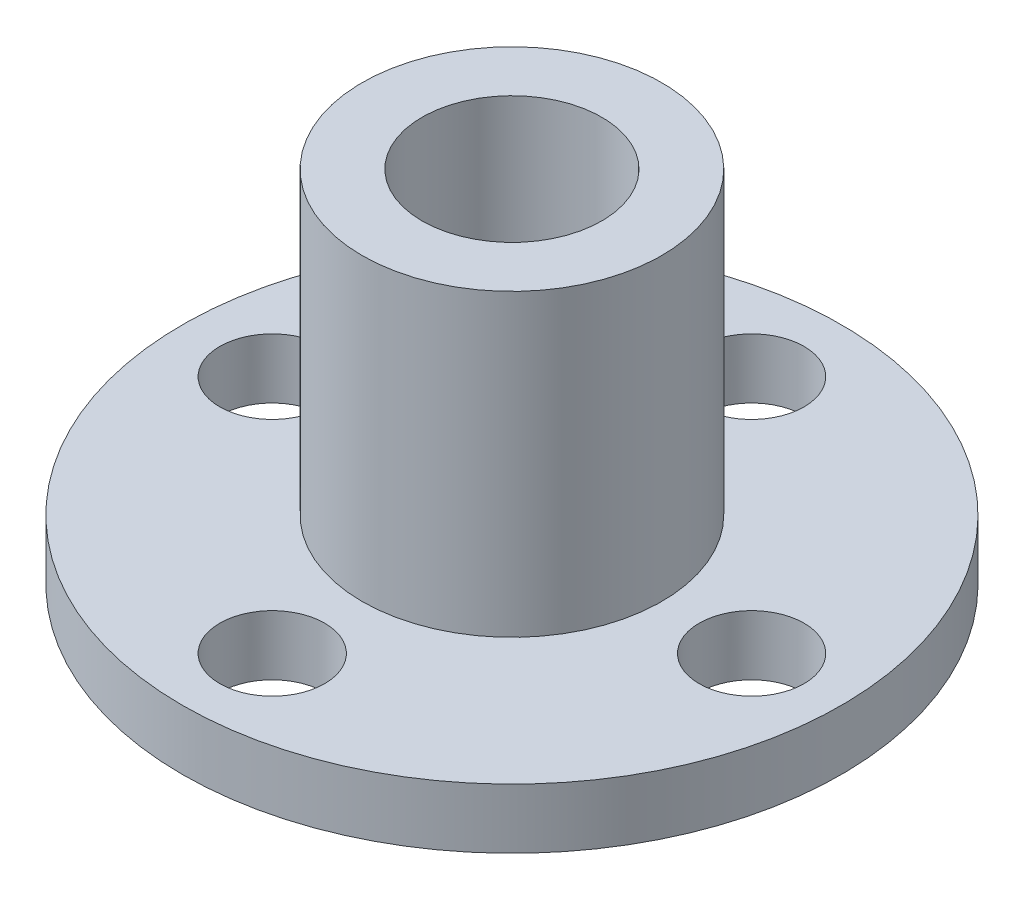
ISO-10303-21;
HEADER;
FILE_DESCRIPTION(('STEP AP214'),'2;1');
FILE_NAME('part.step','',(''),(''),'','','');
FILE_SCHEMA(('AUTOMOTIVE_DESIGN { 1 0 10303 214 1 1 1 1 }'));
ENDSEC;
DATA;
#1=APPLICATION_CONTEXT('core data for automotive mechanical design processes');
#2=APPLICATION_PROTOCOL_DEFINITION('international standard','automotive_design',2000,#1);
#3=PRODUCT_CONTEXT('',#1,'mechanical');
#4=PRODUCT('Part','Part','',(#3));
#5=PRODUCT_RELATED_PRODUCT_CATEGORY('part','',(#4));
#6=PRODUCT_DEFINITION_FORMATION('','',#4);
#7=PRODUCT_DEFINITION_CONTEXT('part definition',#1,'design');
#8=PRODUCT_DEFINITION('design','',#6,#7);
#9=PRODUCT_DEFINITION_SHAPE('','',#8);
#10=(LENGTH_UNIT() NAMED_UNIT(*) SI_UNIT(.MILLI.,.METRE.));
#11=(NAMED_UNIT(*) PLANE_ANGLE_UNIT() SI_UNIT($,.RADIAN.));
#12=(NAMED_UNIT(*) SI_UNIT($,.STERADIAN.) SOLID_ANGLE_UNIT());
#13=UNCERTAINTY_MEASURE_WITH_UNIT(LENGTH_MEASURE(1.E-05),#10,'distance_accuracy_value','');
#14=(GEOMETRIC_REPRESENTATION_CONTEXT(3) GLOBAL_UNCERTAINTY_ASSIGNED_CONTEXT((#13)) GLOBAL_UNIT_ASSIGNED_CONTEXT((#10,
#11,#12)) REPRESENTATION_CONTEXT('',''));
#15=CARTESIAN_POINT('',(0.,0.,0.));
#16=DIRECTION('',(0.,0.,1.));
#17=DIRECTION('',(1.,0.,0.));
#18=AXIS2_PLACEMENT_3D('',#15,#16,#17);
#19=CARTESIAN_POINT('',(0.,2.,0.));
#20=DIRECTION('',(0.,1.,0.));
#21=DIRECTION('',(0.,0.,1.));
#22=AXIS2_PLACEMENT_3D('',#19,#20,#21);
#23=PLANE('',#22);
#24=CARTESIAN_POINT('',(0.,2.,8.));
#25=DIRECTION('',(0.,1.,0.));
#26=DIRECTION('',(0.,0.,1.));
#27=AXIS2_PLACEMENT_3D('',#24,#25,#26);
#28=CIRCLE('',#27,1.75);
#29=CARTESIAN_POINT('',(0.,2.,9.75));
#30=VERTEX_POINT('',#29);
#31=EDGE_CURVE('E78',#30,#30,#28,.T.);
#32=ORIENTED_EDGE('',*,*,#31,.F.);
#33=EDGE_LOOP('',(#32));
#34=FACE_BOUND('',#33,.T.);
#35=CARTESIAN_POINT('',(-8.,2.,0.));
#36=DIRECTION('',(0.,1.,0.));
#37=DIRECTION('',(0.,0.,1.));
#38=AXIS2_PLACEMENT_3D('',#35,#36,#37);
#39=CIRCLE('',#38,1.75);
#40=CARTESIAN_POINT('',(-8.,2.,1.75));
#41=VERTEX_POINT('',#40);
#42=EDGE_CURVE('E85',#41,#41,#39,.T.);
#43=ORIENTED_EDGE('',*,*,#42,.F.);
#44=EDGE_LOOP('',(#43));
#45=FACE_BOUND('',#44,.T.);
#46=CARTESIAN_POINT('',(0.,2.,-8.));
#47=DIRECTION('',(0.,1.,0.));
#48=DIRECTION('',(0.,0.,1.));
#49=AXIS2_PLACEMENT_3D('',#46,#47,#48);
#50=CIRCLE('',#49,1.75);
#51=CARTESIAN_POINT('',(0.,2.,-6.25));
#52=VERTEX_POINT('',#51);
#53=EDGE_CURVE('E89',#52,#52,#50,.T.);
#54=ORIENTED_EDGE('',*,*,#53,.F.);
#55=EDGE_LOOP('',(#54));
#56=FACE_BOUND('',#55,.T.);
#57=CARTESIAN_POINT('',(8.,2.,0.));
#58=DIRECTION('',(0.,1.,0.));
#59=DIRECTION('',(0.,0.,1.));
#60=AXIS2_PLACEMENT_3D('',#57,#58,#59);
#61=CIRCLE('',#60,1.75);
#62=CARTESIAN_POINT('',(8.,2.,1.75));
#63=VERTEX_POINT('',#62);
#64=EDGE_CURVE('E93',#63,#63,#61,.T.);
#65=ORIENTED_EDGE('',*,*,#64,.F.);
#66=EDGE_LOOP('',(#65));
#67=FACE_BOUND('',#66,.T.);
#68=CARTESIAN_POINT('',(0.,2.,0.));
#69=DIRECTION('',(0.,1.,0.));
#70=DIRECTION('',(0.,0.,1.));
#71=AXIS2_PLACEMENT_3D('',#68,#69,#70);
#72=CIRCLE('',#71,5.);
#73=CARTESIAN_POINT('',(0.,2.,5.));
#74=VERTEX_POINT('',#73);
#75=EDGE_CURVE('E66',#74,#74,#72,.T.);
#76=ORIENTED_EDGE('',*,*,#75,.F.);
#77=EDGE_LOOP('',(#76));
#78=FACE_BOUND('',#77,.T.);
#79=CARTESIAN_POINT('',(0.,2.,0.));
#80=DIRECTION('',(0.,1.,0.));
#81=DIRECTION('',(0.,0.,1.));
#82=AXIS2_PLACEMENT_3D('',#79,#80,#81);
#83=CIRCLE('',#82,11.);
#84=CARTESIAN_POINT('',(0.,2.,11.));
#85=VERTEX_POINT('',#84);
#86=EDGE_CURVE('E10',#85,#85,#83,.T.);
#87=ORIENTED_EDGE('',*,*,#86,.T.);
#88=EDGE_LOOP('',(#87));
#89=FACE_BOUND('',#88,.T.);
#90=ADVANCED_FACE('F43',(#34,#45,#56,#67,#78,#89),#23,.T.);
#91=CARTESIAN_POINT('',(0.,0.,0.));
#92=DIRECTION('',(0.,1.,0.));
#93=DIRECTION('',(0.,0.,1.));
#94=AXIS2_PLACEMENT_3D('',#91,#92,#93);
#95=PLANE('',#94);
#96=CARTESIAN_POINT('',(0.,0.,8.));
#97=DIRECTION('',(0.,-1.,0.));
#98=DIRECTION('',(0.,0.,-1.));
#99=AXIS2_PLACEMENT_3D('',#96,#97,#98);
#100=CIRCLE('',#99,1.75);
#101=CARTESIAN_POINT('',(0.,0.,6.25));
#102=VERTEX_POINT('',#101);
#103=EDGE_CURVE('E97',#102,#102,#100,.T.);
#104=ORIENTED_EDGE('',*,*,#103,.F.);
#105=EDGE_LOOP('',(#104));
#106=FACE_BOUND('',#105,.T.);
#107=CARTESIAN_POINT('',(-8.,0.,0.));
#108=DIRECTION('',(0.,-1.,0.));
#109=DIRECTION('',(0.,0.,-1.));
#110=AXIS2_PLACEMENT_3D('',#107,#108,#109);
#111=CIRCLE('',#110,1.75);
#112=CARTESIAN_POINT('',(-8.,0.,-1.75));
#113=VERTEX_POINT('',#112);
#114=EDGE_CURVE('E106',#113,#113,#111,.T.);
#115=ORIENTED_EDGE('',*,*,#114,.F.);
#116=EDGE_LOOP('',(#115));
#117=FACE_BOUND('',#116,.T.);
#118=CARTESIAN_POINT('',(0.,0.,-8.));
#119=DIRECTION('',(0.,-1.,0.));
#120=DIRECTION('',(0.,0.,-1.));
#121=AXIS2_PLACEMENT_3D('',#118,#119,#120);
#122=CIRCLE('',#121,1.75);
#123=CARTESIAN_POINT('',(0.,0.,-9.75));
#124=VERTEX_POINT('',#123);
#125=EDGE_CURVE('E102',#124,#124,#122,.T.);
#126=ORIENTED_EDGE('',*,*,#125,.F.);
#127=EDGE_LOOP('',(#126));
#128=FACE_BOUND('',#127,.T.);
#129=CARTESIAN_POINT('',(8.,0.,0.));
#130=DIRECTION('',(0.,-1.,0.));
#131=DIRECTION('',(0.,0.,-1.));
#132=AXIS2_PLACEMENT_3D('',#129,#130,#131);
#133=CIRCLE('',#132,1.75);
#134=CARTESIAN_POINT('',(8.,0.,-1.75));
#135=VERTEX_POINT('',#134);
#136=EDGE_CURVE('E98',#135,#135,#133,.T.);
#137=ORIENTED_EDGE('',*,*,#136,.F.);
#138=EDGE_LOOP('',(#137));
#139=FACE_BOUND('',#138,.T.);
#140=CARTESIAN_POINT('',(0.,0.,0.));
#141=DIRECTION('',(0.,1.,0.));
#142=DIRECTION('',(0.,0.,1.));
#143=AXIS2_PLACEMENT_3D('',#140,#141,#142);
#144=CIRCLE('',#143,11.);
#145=CARTESIAN_POINT('',(0.,0.,11.));
#146=VERTEX_POINT('',#145);
#147=EDGE_CURVE('E47',#146,#146,#144,.T.);
#148=ORIENTED_EDGE('',*,*,#147,.F.);
#149=EDGE_LOOP('',(#148));
#150=FACE_BOUND('',#149,.T.);
#151=CARTESIAN_POINT('',(0.,0.,0.));
#152=DIRECTION('',(0.,1.,0.));
#153=DIRECTION('',(0.,0.,1.));
#154=AXIS2_PLACEMENT_3D('',#151,#152,#153);
#155=CIRCLE('',#154,4.);
#156=CARTESIAN_POINT('',(0.,0.,4.));
#157=VERTEX_POINT('',#156);
#158=EDGE_CURVE('E56',#157,#157,#155,.T.);
#159=ORIENTED_EDGE('',*,*,#158,.T.);
#160=EDGE_LOOP('',(#159));
#161=FACE_BOUND('',#160,.T.);
#162=ADVANCED_FACE('F116',(#106,#117,#128,#139,#150,#161),#95,.F.);
#163=CARTESIAN_POINT('',(0.,2.,0.));
#164=DIRECTION('',(0.,-1.,0.));
#165=DIRECTION('',(0.,0.,-1.));
#166=AXIS2_PLACEMENT_3D('',#163,#164,#165);
#167=CYLINDRICAL_SURFACE('',#166,11.);
#168=ORIENTED_EDGE('',*,*,#86,.F.);
#169=EDGE_LOOP('',(#168));
#170=FACE_BOUND('',#169,.T.);
#171=ORIENTED_EDGE('',*,*,#147,.T.);
#172=EDGE_LOOP('',(#171));
#173=FACE_BOUND('',#172,.T.);
#174=ADVANCED_FACE('F45',(#170,#173),#167,.T.);
#175=CARTESIAN_POINT('',(0.,2.,0.));
#176=DIRECTION('',(0.,-1.,0.));
#177=DIRECTION('',(0.,0.,-1.));
#178=AXIS2_PLACEMENT_3D('',#175,#176,#177);
#179=CYLINDRICAL_SURFACE('',#178,4.);
#180=CARTESIAN_POINT('',(0.,2.,0.));
#181=DIRECTION('',(0.,1.,0.));
#182=DIRECTION('',(0.,0.,1.));
#183=AXIS2_PLACEMENT_3D('',#180,#181,#182);
#184=CIRCLE('',#183,4.);
#185=CARTESIAN_POINT('',(0.,2.,4.));
#186=VERTEX_POINT('',#185);
#187=EDGE_CURVE('E61',#186,#186,#184,.T.);
#188=ORIENTED_EDGE('',*,*,#187,.T.);
#189=EDGE_LOOP('',(#188));
#190=FACE_BOUND('',#189,.T.);
#191=ORIENTED_EDGE('',*,*,#158,.F.);
#192=EDGE_LOOP('',(#191));
#193=FACE_BOUND('',#192,.T.);
#194=ADVANCED_FACE('F129',(#190,#193),#179,.F.);
#195=CARTESIAN_POINT('',(0.,2.,0.));
#196=DIRECTION('',(0.,1.,0.));
#197=DIRECTION('',(0.,0.,1.));
#198=AXIS2_PLACEMENT_3D('',#195,#196,#197);
#199=PLANE('',#198);
#200=CARTESIAN_POINT('',(0.,2.,0.));
#201=DIRECTION('',(0.,1.,0.));
#202=DIRECTION('',(0.,0.,1.));
#203=AXIS2_PLACEMENT_3D('',#200,#201,#202);
#204=CIRCLE('',#203,3.);
#205=CARTESIAN_POINT('',(0.,2.,3.));
#206=VERTEX_POINT('',#205);
#207=EDGE_CURVE('E74',#206,#206,#204,.T.);
#208=ORIENTED_EDGE('',*,*,#207,.T.);
#209=EDGE_LOOP('',(#208));
#210=FACE_BOUND('',#209,.T.);
#211=ORIENTED_EDGE('',*,*,#187,.F.);
#212=EDGE_LOOP('',(#211));
#213=FACE_BOUND('',#212,.T.);
#214=ADVANCED_FACE('F131',(#210,#213),#199,.F.);
#215=CARTESIAN_POINT('',(0.,12.,0.));
#216=DIRECTION('',(0.,1.,0.));
#217=DIRECTION('',(0.,0.,1.));
#218=AXIS2_PLACEMENT_3D('',#215,#216,#217);
#219=PLANE('',#218);
#220=CARTESIAN_POINT('',(0.,12.,0.));
#221=DIRECTION('',(0.,1.,0.));
#222=DIRECTION('',(0.,0.,1.));
#223=AXIS2_PLACEMENT_3D('',#220,#221,#222);
#224=CIRCLE('',#223,5.);
#225=CARTESIAN_POINT('',(0.,12.,5.));
#226=VERTEX_POINT('',#225);
#227=EDGE_CURVE('E65',#226,#226,#224,.T.);
#228=ORIENTED_EDGE('',*,*,#227,.T.);
#229=EDGE_LOOP('',(#228));
#230=FACE_BOUND('',#229,.T.);
#231=CARTESIAN_POINT('',(0.,12.,0.));
#232=DIRECTION('',(0.,1.,0.));
#233=DIRECTION('',(0.,0.,1.));
#234=AXIS2_PLACEMENT_3D('',#231,#232,#233);
#235=CIRCLE('',#234,3.);
#236=CARTESIAN_POINT('',(0.,12.,3.));
#237=VERTEX_POINT('',#236);
#238=EDGE_CURVE('E70',#237,#237,#235,.T.);
#239=ORIENTED_EDGE('',*,*,#238,.F.);
#240=EDGE_LOOP('',(#239));
#241=FACE_BOUND('',#240,.T.);
#242=ADVANCED_FACE('F138',(#230,#241),#219,.T.);
#243=CARTESIAN_POINT('',(0.,12.,0.));
#244=DIRECTION('',(0.,-1.,0.));
#245=DIRECTION('',(0.,0.,-1.));
#246=AXIS2_PLACEMENT_3D('',#243,#244,#245);
#247=CYLINDRICAL_SURFACE('',#246,5.);
#248=ORIENTED_EDGE('',*,*,#227,.F.);
#249=EDGE_LOOP('',(#248));
#250=FACE_BOUND('',#249,.T.);
#251=ORIENTED_EDGE('',*,*,#75,.T.);
#252=EDGE_LOOP('',(#251));
#253=FACE_BOUND('',#252,.T.);
#254=ADVANCED_FACE('F159',(#250,#253),#247,.T.);
#255=CARTESIAN_POINT('',(0.,12.,0.));
#256=DIRECTION('',(0.,-1.,0.));
#257=DIRECTION('',(0.,0.,-1.));
#258=AXIS2_PLACEMENT_3D('',#255,#256,#257);
#259=CYLINDRICAL_SURFACE('',#258,3.);
#260=ORIENTED_EDGE('',*,*,#238,.T.);
#261=EDGE_LOOP('',(#260));
#262=FACE_BOUND('',#261,.T.);
#263=ORIENTED_EDGE('',*,*,#207,.F.);
#264=EDGE_LOOP('',(#263));
#265=FACE_BOUND('',#264,.T.);
#266=ADVANCED_FACE('F161',(#262,#265),#259,.F.);
#267=CARTESIAN_POINT('',(8.,10.,0.));
#268=DIRECTION('',(0.,-1.,0.));
#269=DIRECTION('',(0.,0.,-1.));
#270=AXIS2_PLACEMENT_3D('',#267,#268,#269);
#271=CYLINDRICAL_SURFACE('',#270,1.75);
#272=ORIENTED_EDGE('',*,*,#64,.T.);
#273=EDGE_LOOP('',(#272));
#274=FACE_BOUND('',#273,.T.);
#275=ORIENTED_EDGE('',*,*,#136,.T.);
#276=EDGE_LOOP('',(#275));
#277=FACE_BOUND('',#276,.T.);
#278=ADVANCED_FACE('F166',(#274,#277),#271,.F.);
#279=CARTESIAN_POINT('',(0.,10.,-8.));
#280=DIRECTION('',(0.,-1.,0.));
#281=DIRECTION('',(0.,0.,-1.));
#282=AXIS2_PLACEMENT_3D('',#279,#280,#281);
#283=CYLINDRICAL_SURFACE('',#282,1.75);
#284=ORIENTED_EDGE('',*,*,#53,.T.);
#285=EDGE_LOOP('',(#284));
#286=FACE_BOUND('',#285,.T.);
#287=ORIENTED_EDGE('',*,*,#125,.T.);
#288=EDGE_LOOP('',(#287));
#289=FACE_BOUND('',#288,.T.);
#290=ADVANCED_FACE('F175',(#286,#289),#283,.F.);
#291=CARTESIAN_POINT('',(-8.,10.,0.));
#292=DIRECTION('',(0.,-1.,0.));
#293=DIRECTION('',(0.,0.,-1.));
#294=AXIS2_PLACEMENT_3D('',#291,#292,#293);
#295=CYLINDRICAL_SURFACE('',#294,1.75);
#296=ORIENTED_EDGE('',*,*,#42,.T.);
#297=EDGE_LOOP('',(#296));
#298=FACE_BOUND('',#297,.T.);
#299=ORIENTED_EDGE('',*,*,#114,.T.);
#300=EDGE_LOOP('',(#299));
#301=FACE_BOUND('',#300,.T.);
#302=ADVANCED_FACE('F179',(#298,#301),#295,.F.);
#303=CARTESIAN_POINT('',(0.,10.,8.));
#304=DIRECTION('',(0.,-1.,0.));
#305=DIRECTION('',(0.,0.,-1.));
#306=AXIS2_PLACEMENT_3D('',#303,#304,#305);
#307=CYLINDRICAL_SURFACE('',#306,1.75);
#308=ORIENTED_EDGE('',*,*,#31,.T.);
#309=EDGE_LOOP('',(#308));
#310=FACE_BOUND('',#309,.T.);
#311=ORIENTED_EDGE('',*,*,#103,.T.);
#312=EDGE_LOOP('',(#311));
#313=FACE_BOUND('',#312,.T.);
#314=ADVANCED_FACE('F114',(#310,#313),#307,.F.);
#315=CLOSED_SHELL('',(#90,#162,#174,#194,#214,#242,#254,#266,#278,#290,#302,#314));
#316=MANIFOLD_SOLID_BREP('B2',#315);
#317=ADVANCED_BREP_SHAPE_REPRESENTATION('',(#18,#316),#14);
#318=SHAPE_DEFINITION_REPRESENTATION(#9,#317);
ENDSEC;
END-ISO-10303-21;
